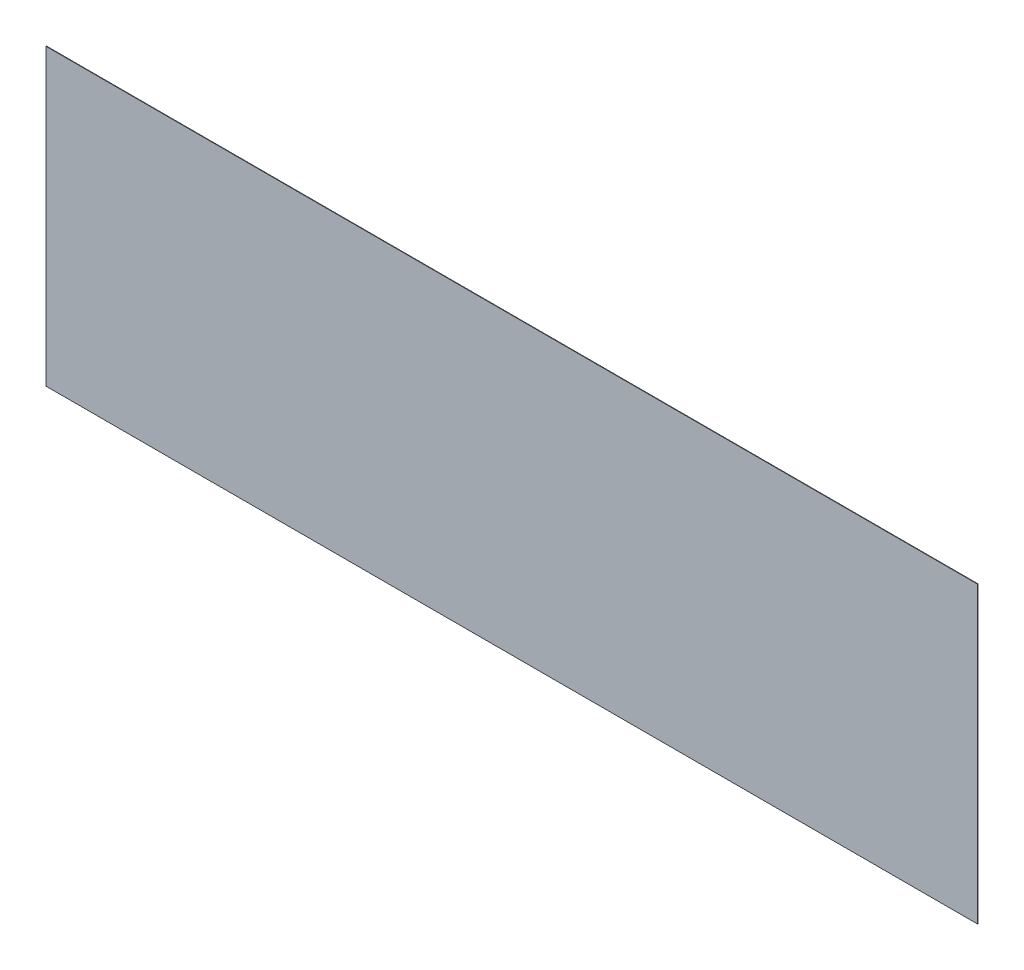
ISO-10303-21;
HEADER;
FILE_DESCRIPTION(('STEP AP214'),'2;1');
FILE_NAME('part.step','',(''),(''),'','','');
FILE_SCHEMA(('AUTOMOTIVE_DESIGN { 1 0 10303 214 1 1 1 1 }'));
ENDSEC;
DATA;
#1=APPLICATION_CONTEXT('core data for automotive mechanical design processes');
#2=APPLICATION_PROTOCOL_DEFINITION('international standard','automotive_design',2000,#1);
#3=PRODUCT_CONTEXT('',#1,'mechanical');
#4=PRODUCT('Part','Part','',(#3));
#5=PRODUCT_RELATED_PRODUCT_CATEGORY('part','',(#4));
#6=PRODUCT_DEFINITION_FORMATION('','',#4);
#7=PRODUCT_DEFINITION_CONTEXT('part definition',#1,'design');
#8=PRODUCT_DEFINITION('design','',#6,#7);
#9=PRODUCT_DEFINITION_SHAPE('','',#8);
#10=(LENGTH_UNIT() NAMED_UNIT(*) SI_UNIT(.MILLI.,.METRE.));
#11=(NAMED_UNIT(*) PLANE_ANGLE_UNIT() SI_UNIT($,.RADIAN.));
#12=(NAMED_UNIT(*) SI_UNIT($,.STERADIAN.) SOLID_ANGLE_UNIT());
#13=UNCERTAINTY_MEASURE_WITH_UNIT(LENGTH_MEASURE(1.E-05),#10,'distance_accuracy_value','');
#14=(GEOMETRIC_REPRESENTATION_CONTEXT(3) GLOBAL_UNCERTAINTY_ASSIGNED_CONTEXT((#13)) GLOBAL_UNIT_ASSIGNED_CONTEXT((#10,
#11,#12)) REPRESENTATION_CONTEXT('',''));
#15=CARTESIAN_POINT('',(0.,0.,0.));
#16=DIRECTION('',(0.,0.,1.));
#17=DIRECTION('',(1.,0.,0.));
#18=AXIS2_PLACEMENT_3D('',#15,#16,#17);
#19=CARTESIAN_POINT('',(-400000.,-60.0000000000023,151.327));
#20=DIRECTION('',(0.,-1.,0.));
#21=DIRECTION('',(0.,0.,-1.));
#22=AXIS2_PLACEMENT_3D('',#19,#20,#21);
#23=PLANE('',#22);
#24=DIRECTION('',(-1.,0.,0.));
#25=VECTOR('',#24,1.);
#26=CARTESIAN_POINT('',(-400000.,-60.0000000000023,151.2));
#27=LINE('',#26,#25);
#28=CARTESIAN_POINT('',(125.000000000023,-60.0000000000023,151.2));
#29=VERTEX_POINT('',#28);
#30=CARTESIAN_POINT('',(-125.000000000011,-60.0000000000023,151.2));
#31=VERTEX_POINT('',#30);
#32=EDGE_CURVE('E80',#29,#31,#27,.T.);
#33=ORIENTED_EDGE('',*,*,#32,.F.);
#34=DIRECTION('',(0.,0.,-1.));
#35=VECTOR('',#34,1.);
#36=CARTESIAN_POINT('',(125.000000000023,-60.0000000000023,151.327));
#37=LINE('',#36,#35);
#38=CARTESIAN_POINT('',(125.000000000023,-60.0000000000023,151.327));
#39=VERTEX_POINT('',#38);
#40=EDGE_CURVE('E48',#39,#29,#37,.T.);
#41=ORIENTED_EDGE('',*,*,#40,.F.);
#42=DIRECTION('',(-1.,0.,0.));
#43=VECTOR('',#42,1.);
#44=CARTESIAN_POINT('',(-400000.,-60.0000000000023,151.327));
#45=LINE('',#44,#43);
#46=CARTESIAN_POINT('',(-125.000000000011,-60.0000000000023,151.327));
#47=VERTEX_POINT('',#46);
#48=EDGE_CURVE('E81',#39,#47,#45,.T.);
#49=ORIENTED_EDGE('',*,*,#48,.T.);
#50=DIRECTION('',(0.,0.,-1.));
#51=VECTOR('',#50,1.);
#52=CARTESIAN_POINT('',(-125.000000000011,-60.0000000000023,151.327));
#53=LINE('',#52,#51);
#54=EDGE_CURVE('E88',#47,#31,#53,.T.);
#55=ORIENTED_EDGE('',*,*,#54,.T.);
#56=EDGE_LOOP('',(#33,#41,#49,#55));
#57=FACE_BOUND('',#56,.T.);
#58=ADVANCED_FACE('F41',(#57),#23,.T.);
#59=CARTESIAN_POINT('',(125.000000000057,-291534.,151.327));
#60=DIRECTION('',(1.,0.,0.));
#61=DIRECTION('',(0.,1.,0.));
#62=AXIS2_PLACEMENT_3D('',#59,#60,#61);
#63=PLANE('',#62);
#64=DIRECTION('',(0.,0.,1.));
#65=VECTOR('',#64,1.);
#66=CARTESIAN_POINT('',(125.000000000023,19.0000000000023,141.327));
#67=LINE('',#66,#65);
#68=CARTESIAN_POINT('',(125.000000000023,19.0000000000055,151.2));
#69=VERTEX_POINT('',#68);
#70=CARTESIAN_POINT('',(125.000000000023,19.0000000000023,151.327));
#71=VERTEX_POINT('',#70);
#72=EDGE_CURVE('E54',#69,#71,#67,.T.);
#73=ORIENTED_EDGE('',*,*,#72,.T.);
#74=DIRECTION('',(0.,-1.,0.));
#75=VECTOR('',#74,1.);
#76=CARTESIAN_POINT('',(125.000000000057,-291534.,151.327));
#77=LINE('',#76,#75);
#78=EDGE_CURVE('E62',#71,#39,#77,.T.);
#79=ORIENTED_EDGE('',*,*,#78,.T.);
#80=ORIENTED_EDGE('',*,*,#40,.T.);
#81=DIRECTION('',(0.,-1.,0.));
#82=VECTOR('',#81,1.);
#83=CARTESIAN_POINT('',(125.000000000057,-291534.,151.2));
#84=LINE('',#83,#82);
#85=EDGE_CURVE('E76',#69,#29,#84,.T.);
#86=ORIENTED_EDGE('',*,*,#85,.F.);
#87=EDGE_LOOP('',(#73,#79,#80,#86));
#88=FACE_BOUND('',#87,.T.);
#89=ADVANCED_FACE('F84',(#88),#63,.T.);
#90=CARTESIAN_POINT('',(-124.999999999943,-291534.,151.327));
#91=DIRECTION('',(-1.,0.,0.));
#92=DIRECTION('',(0.,-1.,0.));
#93=AXIS2_PLACEMENT_3D('',#90,#91,#92);
#94=PLANE('',#93);
#95=DIRECTION('',(0.,0.,1.));
#96=VECTOR('',#95,1.);
#97=CARTESIAN_POINT('',(-125.000000000011,19.0000000000023,141.327));
#98=LINE('',#97,#96);
#99=CARTESIAN_POINT('',(-125.000000000011,19.0000000000023,151.2));
#100=VERTEX_POINT('',#99);
#101=CARTESIAN_POINT('',(-125.000000000011,19.0000000000023,151.327));
#102=VERTEX_POINT('',#101);
#103=EDGE_CURVE('E93',#100,#102,#98,.T.);
#104=ORIENTED_EDGE('',*,*,#103,.F.);
#105=DIRECTION('',(0.,1.,0.));
#106=VECTOR('',#105,1.);
#107=CARTESIAN_POINT('',(-124.999999999943,-291534.,151.2));
#108=LINE('',#107,#106);
#109=EDGE_CURVE('E82',#31,#100,#108,.T.);
#110=ORIENTED_EDGE('',*,*,#109,.F.);
#111=ORIENTED_EDGE('',*,*,#54,.F.);
#112=DIRECTION('',(0.,1.,0.));
#113=VECTOR('',#112,1.);
#114=CARTESIAN_POINT('',(-124.999999999943,-291534.,151.327));
#115=LINE('',#114,#113);
#116=EDGE_CURVE('E97',#47,#102,#115,.T.);
#117=ORIENTED_EDGE('',*,*,#116,.T.);
#118=EDGE_LOOP('',(#104,#110,#111,#117));
#119=FACE_BOUND('',#118,.T.);
#120=ADVANCED_FACE('F115',(#119),#94,.T.);
#121=CARTESIAN_POINT('',(0.,0.,151.327));
#122=DIRECTION('',(0.,0.,-1.));
#123=DIRECTION('',(-1.,0.,0.));
#124=AXIS2_PLACEMENT_3D('',#121,#122,#123);
#125=PLANE('',#124);
#126=ORIENTED_EDGE('',*,*,#78,.F.);
#127=DIRECTION('',(1.,0.,0.));
#128=VECTOR('',#127,1.);
#129=CARTESIAN_POINT('',(-125.000000000011,19.0000000000023,151.327));
#130=LINE('',#129,#128);
#131=EDGE_CURVE('E106',#102,#71,#130,.T.);
#132=ORIENTED_EDGE('',*,*,#131,.F.);
#133=ORIENTED_EDGE('',*,*,#116,.F.);
#134=ORIENTED_EDGE('',*,*,#48,.F.);
#135=EDGE_LOOP('',(#126,#132,#133,#134));
#136=FACE_BOUND('',#135,.T.);
#137=ADVANCED_FACE('F113',(#136),#125,.F.);
#138=CARTESIAN_POINT('',(0.,0.,151.2));
#139=DIRECTION('',(0.,0.,-1.));
#140=DIRECTION('',(-1.,0.,0.));
#141=AXIS2_PLACEMENT_3D('',#138,#139,#140);
#142=PLANE('',#141);
#143=DIRECTION('',(-1.,0.,0.));
#144=VECTOR('',#143,1.);
#145=CARTESIAN_POINT('',(0.,19.0000000000023,151.2));
#146=LINE('',#145,#144);
#147=EDGE_CURVE('E11',#69,#100,#146,.T.);
#148=ORIENTED_EDGE('',*,*,#147,.F.);
#149=ORIENTED_EDGE('',*,*,#85,.T.);
#150=ORIENTED_EDGE('',*,*,#32,.T.);
#151=ORIENTED_EDGE('',*,*,#109,.T.);
#152=EDGE_LOOP('',(#148,#149,#150,#151));
#153=FACE_BOUND('',#152,.T.);
#154=ADVANCED_FACE('F77',(#153),#142,.T.);
#155=CARTESIAN_POINT('',(-125.000000000011,19.0000000000023,141.327));
#156=DIRECTION('',(0.,-1.,0.));
#157=DIRECTION('',(0.,0.,-1.));
#158=AXIS2_PLACEMENT_3D('',#155,#156,#157);
#159=PLANE('',#158);
#160=ORIENTED_EDGE('',*,*,#147,.T.);
#161=ORIENTED_EDGE('',*,*,#103,.T.);
#162=ORIENTED_EDGE('',*,*,#131,.T.);
#163=ORIENTED_EDGE('',*,*,#72,.F.);
#164=EDGE_LOOP('',(#160,#161,#162,#163));
#165=FACE_BOUND('',#164,.T.);
#166=ADVANCED_FACE('F110',(#165),#159,.F.);
#167=CLOSED_SHELL('',(#58,#89,#120,#137,#154,#166));
#168=MANIFOLD_SOLID_BREP('B2',#167);
#169=ADVANCED_BREP_SHAPE_REPRESENTATION('',(#18,#168),#14);
#170=SHAPE_DEFINITION_REPRESENTATION(#9,#169);
ENDSEC;
END-ISO-10303-21;
